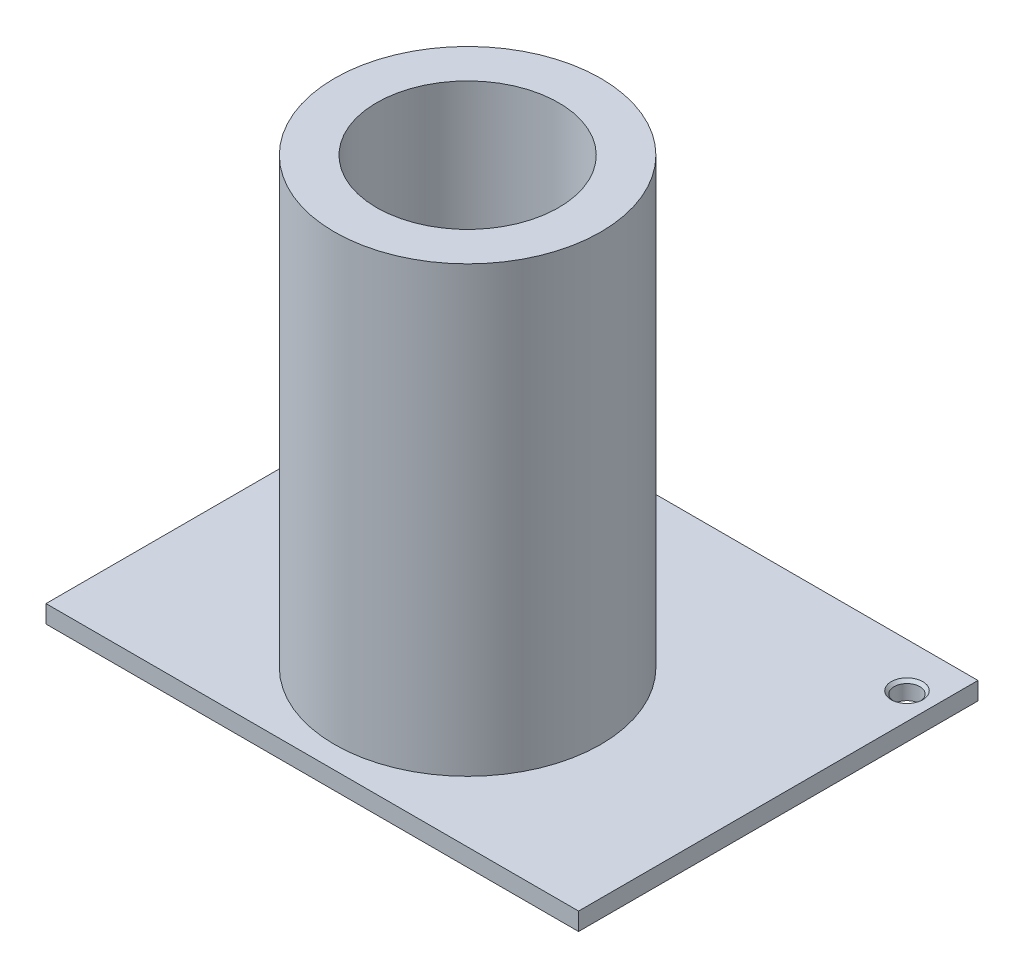
ISO-10303-21;
HEADER;
FILE_DESCRIPTION(('STEP AP214'),'2;1');
FILE_NAME('part.step','',(''),(''),'','','');
FILE_SCHEMA(('AUTOMOTIVE_DESIGN { 1 0 10303 214 1 1 1 1 }'));
ENDSEC;
DATA;
#1=APPLICATION_CONTEXT('core data for automotive mechanical design processes');
#2=APPLICATION_PROTOCOL_DEFINITION('international standard','automotive_design',2000,#1);
#3=PRODUCT_CONTEXT('',#1,'mechanical');
#4=PRODUCT('Part','Part','',(#3));
#5=PRODUCT_RELATED_PRODUCT_CATEGORY('part','',(#4));
#6=PRODUCT_DEFINITION_FORMATION('','',#4);
#7=PRODUCT_DEFINITION_CONTEXT('part definition',#1,'design');
#8=PRODUCT_DEFINITION('design','',#6,#7);
#9=PRODUCT_DEFINITION_SHAPE('','',#8);
#10=(LENGTH_UNIT() NAMED_UNIT(*) SI_UNIT(.MILLI.,.METRE.));
#11=(NAMED_UNIT(*) PLANE_ANGLE_UNIT() SI_UNIT($,.RADIAN.));
#12=(NAMED_UNIT(*) SI_UNIT($,.STERADIAN.) SOLID_ANGLE_UNIT());
#13=UNCERTAINTY_MEASURE_WITH_UNIT(LENGTH_MEASURE(1.E-05),#10,'distance_accuracy_value','');
#14=(GEOMETRIC_REPRESENTATION_CONTEXT(3) GLOBAL_UNCERTAINTY_ASSIGNED_CONTEXT((#13)) GLOBAL_UNIT_ASSIGNED_CONTEXT((#10,
#11,#12)) REPRESENTATION_CONTEXT('',''));
#15=CARTESIAN_POINT('',(0.,0.,0.));
#16=DIRECTION('',(0.,0.,1.));
#17=DIRECTION('',(1.,0.,0.));
#18=AXIS2_PLACEMENT_3D('',#15,#16,#17);
#19=CARTESIAN_POINT('',(0.,2.,-30.));
#20=DIRECTION('',(0.,0.,1.));
#21=DIRECTION('',(1.,0.,0.));
#22=AXIS2_PLACEMENT_3D('',#19,#20,#21);
#23=PLANE('',#22);
#24=DIRECTION('',(-1.,0.,0.));
#25=VECTOR('',#24,1.);
#26=CARTESIAN_POINT('',(0.,0.,-30.));
#27=LINE('',#26,#25);
#28=CARTESIAN_POINT('',(0.,0.,-30.));
#29=VERTEX_POINT('',#28);
#30=CARTESIAN_POINT('',(-60.,0.,-30.));
#31=VERTEX_POINT('',#30);
#32=EDGE_CURVE('E110',#29,#31,#27,.T.);
#33=ORIENTED_EDGE('',*,*,#32,.T.);
#34=DIRECTION('',(0.,-1.,0.));
#35=VECTOR('',#34,1.);
#36=CARTESIAN_POINT('',(-60.,2.,-30.));
#37=LINE('',#36,#35);
#38=CARTESIAN_POINT('',(-60.,2.,-30.));
#39=VERTEX_POINT('',#38);
#40=EDGE_CURVE('E51',#39,#31,#37,.T.);
#41=ORIENTED_EDGE('',*,*,#40,.F.);
#42=DIRECTION('',(-1.,0.,0.));
#43=VECTOR('',#42,1.);
#44=CARTESIAN_POINT('',(0.,2.,-30.));
#45=LINE('',#44,#43);
#46=CARTESIAN_POINT('',(0.,2.,-30.));
#47=VERTEX_POINT('',#46);
#48=EDGE_CURVE('E86',#47,#39,#45,.T.);
#49=ORIENTED_EDGE('',*,*,#48,.F.);
#50=DIRECTION('',(0.,-1.,0.));
#51=VECTOR('',#50,1.);
#52=CARTESIAN_POINT('',(0.,2.,-30.));
#53=LINE('',#52,#51);
#54=EDGE_CURVE('E109',#47,#29,#53,.T.);
#55=ORIENTED_EDGE('',*,*,#54,.T.);
#56=EDGE_LOOP('',(#33,#41,#49,#55));
#57=FACE_BOUND('',#56,.T.);
#58=ADVANCED_FACE('F43',(#57),#23,.F.);
#59=CARTESIAN_POINT('',(-60.,2.,0.));
#60=DIRECTION('',(-1.,0.,0.));
#61=DIRECTION('',(0.,0.,1.));
#62=AXIS2_PLACEMENT_3D('',#59,#60,#61);
#63=PLANE('',#62);
#64=DIRECTION('',(0.,0.,-1.));
#65=VECTOR('',#64,1.);
#66=CARTESIAN_POINT('',(-60.,0.,0.));
#67=LINE('',#66,#65);
#68=CARTESIAN_POINT('',(-60.,0.,15.));
#69=VERTEX_POINT('',#68);
#70=EDGE_CURVE('E97',#69,#31,#67,.T.);
#71=ORIENTED_EDGE('',*,*,#70,.F.);
#72=DIRECTION('',(0.,-1.,0.));
#73=VECTOR('',#72,1.);
#74=CARTESIAN_POINT('',(-60.,2.,15.));
#75=LINE('',#74,#73);
#76=CARTESIAN_POINT('',(-60.,2.,15.));
#77=VERTEX_POINT('',#76);
#78=EDGE_CURVE('E92',#77,#69,#75,.T.);
#79=ORIENTED_EDGE('',*,*,#78,.F.);
#80=DIRECTION('',(0.,0.,-1.));
#81=VECTOR('',#80,1.);
#82=CARTESIAN_POINT('',(-60.,2.,0.));
#83=LINE('',#82,#81);
#84=EDGE_CURVE('E95',#77,#39,#83,.T.);
#85=ORIENTED_EDGE('',*,*,#84,.T.);
#86=ORIENTED_EDGE('',*,*,#40,.T.);
#87=EDGE_LOOP('',(#71,#79,#85,#86));
#88=FACE_BOUND('',#87,.T.);
#89=ADVANCED_FACE('F94',(#88),#63,.T.);
#90=CARTESIAN_POINT('',(0.,2.,15.));
#91=DIRECTION('',(0.,0.,-1.));
#92=DIRECTION('',(-1.,0.,0.));
#93=AXIS2_PLACEMENT_3D('',#90,#91,#92);
#94=PLANE('',#93);
#95=DIRECTION('',(1.,0.,0.));
#96=VECTOR('',#95,1.);
#97=CARTESIAN_POINT('',(0.,0.,15.));
#98=LINE('',#97,#96);
#99=CARTESIAN_POINT('',(0.,0.,15.));
#100=VERTEX_POINT('',#99);
#101=EDGE_CURVE('E75',#69,#100,#98,.T.);
#102=ORIENTED_EDGE('',*,*,#101,.T.);
#103=DIRECTION('',(0.,-1.,0.));
#104=VECTOR('',#103,1.);
#105=CARTESIAN_POINT('',(0.,2.,15.));
#106=LINE('',#105,#104);
#107=CARTESIAN_POINT('',(0.,2.,15.));
#108=VERTEX_POINT('',#107);
#109=EDGE_CURVE('E98',#108,#100,#106,.T.);
#110=ORIENTED_EDGE('',*,*,#109,.F.);
#111=DIRECTION('',(1.,0.,0.));
#112=VECTOR('',#111,1.);
#113=CARTESIAN_POINT('',(0.,2.,15.));
#114=LINE('',#113,#112);
#115=EDGE_CURVE('E100',#77,#108,#114,.T.);
#116=ORIENTED_EDGE('',*,*,#115,.F.);
#117=ORIENTED_EDGE('',*,*,#78,.T.);
#118=EDGE_LOOP('',(#102,#110,#116,#117));
#119=FACE_BOUND('',#118,.T.);
#120=ADVANCED_FACE('F101',(#119),#94,.F.);
#121=CARTESIAN_POINT('',(0.,2.,0.));
#122=DIRECTION('',(-1.,0.,0.));
#123=DIRECTION('',(0.,0.,1.));
#124=AXIS2_PLACEMENT_3D('',#121,#122,#123);
#125=PLANE('',#124);
#126=DIRECTION('',(0.,0.,-1.));
#127=VECTOR('',#126,1.);
#128=CARTESIAN_POINT('',(0.,0.,0.));
#129=LINE('',#128,#127);
#130=EDGE_CURVE('E81',#100,#29,#129,.T.);
#131=ORIENTED_EDGE('',*,*,#130,.T.);
#132=ORIENTED_EDGE('',*,*,#54,.F.);
#133=DIRECTION('',(0.,0.,-1.));
#134=VECTOR('',#133,1.);
#135=CARTESIAN_POINT('',(0.,2.,0.));
#136=LINE('',#135,#134);
#137=EDGE_CURVE('E59',#108,#47,#136,.T.);
#138=ORIENTED_EDGE('',*,*,#137,.F.);
#139=ORIENTED_EDGE('',*,*,#109,.T.);
#140=EDGE_LOOP('',(#131,#132,#138,#139));
#141=FACE_BOUND('',#140,.T.);
#142=ADVANCED_FACE('F154',(#141),#125,.F.);
#143=CARTESIAN_POINT('',(0.,2.,0.));
#144=DIRECTION('',(0.,1.,0.));
#145=DIRECTION('',(0.,0.,1.));
#146=AXIS2_PLACEMENT_3D('',#143,#144,#145);
#147=PLANE('',#146);
#148=CARTESIAN_POINT('',(-30.,2.,-2.5));
#149=DIRECTION('',(0.,1.,0.));
#150=DIRECTION('',(0.,0.,1.));
#151=AXIS2_PLACEMENT_3D('',#148,#149,#150);
#152=CIRCLE('',#151,15.);
#153=CARTESIAN_POINT('',(-30.,2.,12.5));
#154=VERTEX_POINT('',#153);
#155=EDGE_CURVE('E331',#154,#154,#152,.T.);
#156=ORIENTED_EDGE('',*,*,#155,.F.);
#157=EDGE_LOOP('',(#156));
#158=FACE_BOUND('',#157,.T.);
#159=CARTESIAN_POINT('',(-3.,2.,-25.));
#160=DIRECTION('',(0.,1.,0.));
#161=DIRECTION('',(0.,0.,1.));
#162=AXIS2_PLACEMENT_3D('',#159,#160,#161);
#163=CIRCLE('',#162,1.775);
#164=CARTESIAN_POINT('',(-3.,2.,-23.225));
#165=VERTEX_POINT('',#164);
#166=EDGE_CURVE('E131',#165,#165,#163,.T.);
#167=ORIENTED_EDGE('',*,*,#166,.F.);
#168=EDGE_LOOP('',(#167));
#169=FACE_BOUND('',#168,.T.);
#170=CARTESIAN_POINT('',(-57.,2.,-25.));
#171=DIRECTION('',(0.,1.,0.));
#172=DIRECTION('',(0.,0.,1.));
#173=AXIS2_PLACEMENT_3D('',#170,#171,#172);
#174=CIRCLE('',#173,1.775);
#175=CARTESIAN_POINT('',(-57.,2.,-23.225));
#176=VERTEX_POINT('',#175);
#177=EDGE_CURVE('E124',#176,#176,#174,.T.);
#178=ORIENTED_EDGE('',*,*,#177,.F.);
#179=EDGE_LOOP('',(#178));
#180=FACE_BOUND('',#179,.T.);
#181=ORIENTED_EDGE('',*,*,#48,.T.);
#182=ORIENTED_EDGE('',*,*,#84,.F.);
#183=ORIENTED_EDGE('',*,*,#115,.T.);
#184=ORIENTED_EDGE('',*,*,#137,.T.);
#185=EDGE_LOOP('',(#181,#182,#183,#184));
#186=FACE_BOUND('',#185,.T.);
#187=ADVANCED_FACE('F103',(#158,#169,#180,#186),#147,.T.);
#188=CARTESIAN_POINT('',(0.,0.,0.));
#189=DIRECTION('',(0.,1.,0.));
#190=DIRECTION('',(0.,0.,1.));
#191=AXIS2_PLACEMENT_3D('',#188,#189,#190);
#192=PLANE('',#191);
#193=CARTESIAN_POINT('',(-3.,0.,-25.));
#194=DIRECTION('',(0.,1.,0.));
#195=DIRECTION('',(0.,0.,1.));
#196=AXIS2_PLACEMENT_3D('',#193,#194,#195);
#197=CIRCLE('',#196,1.45);
#198=CARTESIAN_POINT('',(-3.,0.,-23.55));
#199=VERTEX_POINT('',#198);
#200=EDGE_CURVE('E122',#199,#199,#197,.T.);
#201=ORIENTED_EDGE('',*,*,#200,.T.);
#202=EDGE_LOOP('',(#201));
#203=FACE_BOUND('',#202,.T.);
#204=CARTESIAN_POINT('',(-57.,0.,-25.));
#205=DIRECTION('',(0.,1.,0.));
#206=DIRECTION('',(0.,0.,1.));
#207=AXIS2_PLACEMENT_3D('',#204,#205,#206);
#208=CIRCLE('',#207,1.45);
#209=CARTESIAN_POINT('',(-57.,0.,-23.55));
#210=VERTEX_POINT('',#209);
#211=EDGE_CURVE('E113',#210,#210,#208,.T.);
#212=ORIENTED_EDGE('',*,*,#211,.T.);
#213=EDGE_LOOP('',(#212));
#214=FACE_BOUND('',#213,.T.);
#215=ORIENTED_EDGE('',*,*,#32,.F.);
#216=ORIENTED_EDGE('',*,*,#130,.F.);
#217=ORIENTED_EDGE('',*,*,#101,.F.);
#218=ORIENTED_EDGE('',*,*,#70,.T.);
#219=EDGE_LOOP('',(#215,#216,#217,#218));
#220=FACE_BOUND('',#219,.T.);
#221=ADVANCED_FACE('F153',(#203,#214,#220),#192,.F.);
#222=CARTESIAN_POINT('',(-57.,2.,-25.));
#223=DIRECTION('',(0.,1.,0.));
#224=DIRECTION('',(0.,0.,1.));
#225=AXIS2_PLACEMENT_3D('',#222,#223,#224);
#226=CYLINDRICAL_SURFACE('',#225,1.45);
#227=CARTESIAN_POINT('',(-57.,1.675,-25.));
#228=DIRECTION('',(0.,1.,0.));
#229=DIRECTION('',(0.,0.,1.));
#230=AXIS2_PLACEMENT_3D('',#227,#228,#229);
#231=CIRCLE('',#230,1.45);
#232=CARTESIAN_POINT('',(-57.,1.675,-23.55));
#233=VERTEX_POINT('',#232);
#234=EDGE_CURVE('E121',#233,#233,#231,.T.);
#235=ORIENTED_EDGE('',*,*,#234,.T.);
#236=EDGE_LOOP('',(#235));
#237=FACE_BOUND('',#236,.T.);
#238=ORIENTED_EDGE('',*,*,#211,.F.);
#239=EDGE_LOOP('',(#238));
#240=FACE_BOUND('',#239,.T.);
#241=ADVANCED_FACE('F142',(#237,#240),#226,.F.);
#242=CARTESIAN_POINT('',(-57.,2.,-25.));
#243=DIRECTION('',(0.,1.,0.));
#244=DIRECTION('',(0.,0.,1.));
#245=AXIS2_PLACEMENT_3D('',#242,#243,#244);
#246=CONICAL_SURFACE('',#245,1.775,0.785398163397446);
#247=ORIENTED_EDGE('',*,*,#234,.F.);
#248=EDGE_LOOP('',(#247));
#249=FACE_BOUND('',#248,.T.);
#250=ORIENTED_EDGE('',*,*,#177,.T.);
#251=EDGE_LOOP('',(#250));
#252=FACE_BOUND('',#251,.T.);
#253=ADVANCED_FACE('F145',(#249,#252),#246,.F.);
#254=CARTESIAN_POINT('',(-3.,2.,-25.));
#255=DIRECTION('',(0.,1.,0.));
#256=DIRECTION('',(0.,0.,1.));
#257=AXIS2_PLACEMENT_3D('',#254,#255,#256);
#258=CYLINDRICAL_SURFACE('',#257,1.45);
#259=CARTESIAN_POINT('',(-3.,1.675,-25.));
#260=DIRECTION('',(0.,1.,0.));
#261=DIRECTION('',(0.,0.,1.));
#262=AXIS2_PLACEMENT_3D('',#259,#260,#261);
#263=CIRCLE('',#262,1.45);
#264=CARTESIAN_POINT('',(-3.,1.675,-23.55));
#265=VERTEX_POINT('',#264);
#266=EDGE_CURVE('E125',#265,#265,#263,.T.);
#267=ORIENTED_EDGE('',*,*,#266,.T.);
#268=EDGE_LOOP('',(#267));
#269=FACE_BOUND('',#268,.T.);
#270=ORIENTED_EDGE('',*,*,#200,.F.);
#271=EDGE_LOOP('',(#270));
#272=FACE_BOUND('',#271,.T.);
#273=ADVANCED_FACE('F148',(#269,#272),#258,.F.);
#274=CARTESIAN_POINT('',(-3.,2.,-25.));
#275=DIRECTION('',(0.,1.,0.));
#276=DIRECTION('',(0.,0.,1.));
#277=AXIS2_PLACEMENT_3D('',#274,#275,#276);
#278=CONICAL_SURFACE('',#277,1.775,0.785398163397449);
#279=ORIENTED_EDGE('',*,*,#266,.F.);
#280=EDGE_LOOP('',(#279));
#281=FACE_BOUND('',#280,.T.);
#282=ORIENTED_EDGE('',*,*,#166,.T.);
#283=EDGE_LOOP('',(#282));
#284=FACE_BOUND('',#283,.T.);
#285=ADVANCED_FACE('F222',(#281,#284),#278,.F.);
#286=CARTESIAN_POINT('',(-30.,52.,-2.5));
#287=DIRECTION('',(0.,1.,0.));
#288=DIRECTION('',(0.,0.,1.));
#289=AXIS2_PLACEMENT_3D('',#286,#287,#288);
#290=PLANE('',#289);
#291=CARTESIAN_POINT('',(-30.,52.,-2.5));
#292=DIRECTION('',(0.,1.,0.));
#293=DIRECTION('',(0.,0.,1.));
#294=AXIS2_PLACEMENT_3D('',#291,#292,#293);
#295=CIRCLE('',#294,15.);
#296=CARTESIAN_POINT('',(-30.,52.,12.5));
#297=VERTEX_POINT('',#296);
#298=EDGE_CURVE('E136',#297,#297,#295,.T.);
#299=ORIENTED_EDGE('',*,*,#298,.T.);
#300=EDGE_LOOP('',(#299));
#301=FACE_BOUND('',#300,.T.);
#302=CARTESIAN_POINT('',(-30.,52.,-2.5));
#303=DIRECTION('',(0.,1.,0.));
#304=DIRECTION('',(0.,0.,1.));
#305=AXIS2_PLACEMENT_3D('',#302,#303,#304);
#306=CIRCLE('',#305,10.25);
#307=CARTESIAN_POINT('',(-30.,52.,7.75));
#308=VERTEX_POINT('',#307);
#309=EDGE_CURVE('E328',#308,#308,#306,.T.);
#310=ORIENTED_EDGE('',*,*,#309,.F.);
#311=EDGE_LOOP('',(#310));
#312=FACE_BOUND('',#311,.T.);
#313=ADVANCED_FACE('F231',(#301,#312),#290,.T.);
#314=CARTESIAN_POINT('',(-30.,52.,-2.5));
#315=DIRECTION('',(0.,-1.,0.));
#316=DIRECTION('',(0.,0.,-1.));
#317=AXIS2_PLACEMENT_3D('',#314,#315,#316);
#318=CYLINDRICAL_SURFACE('',#317,15.);
#319=ORIENTED_EDGE('',*,*,#298,.F.);
#320=EDGE_LOOP('',(#319));
#321=FACE_BOUND('',#320,.T.);
#322=ORIENTED_EDGE('',*,*,#155,.T.);
#323=EDGE_LOOP('',(#322));
#324=FACE_BOUND('',#323,.T.);
#325=ADVANCED_FACE('F248',(#321,#324),#318,.T.);
#326=CARTESIAN_POINT('',(-30.,52.,-2.5));
#327=DIRECTION('',(0.,-1.,0.));
#328=DIRECTION('',(0.,0.,-1.));
#329=AXIS2_PLACEMENT_3D('',#326,#327,#328);
#330=CYLINDRICAL_SURFACE('',#329,10.25);
#331=ORIENTED_EDGE('',*,*,#309,.T.);
#332=EDGE_LOOP('',(#331));
#333=FACE_BOUND('',#332,.T.);
#334=CARTESIAN_POINT('',(-30.,2.,-2.5));
#335=DIRECTION('',(0.,1.,0.));
#336=DIRECTION('',(0.,0.,1.));
#337=AXIS2_PLACEMENT_3D('',#334,#335,#336);
#338=CIRCLE('',#337,10.25);
#339=CARTESIAN_POINT('',(-30.,2.,7.75));
#340=VERTEX_POINT('',#339);
#341=EDGE_CURVE('E11',#340,#340,#338,.F.);
#342=ORIENTED_EDGE('',*,*,#341,.T.);
#343=EDGE_LOOP('',(#342));
#344=FACE_BOUND('',#343,.T.);
#345=ADVANCED_FACE('F168',(#333,#344),#330,.F.);
#346=ORIENTED_EDGE('',*,*,#341,.F.);
#347=EDGE_LOOP('',(#346));
#348=FACE_BOUND('',#347,.T.);
#349=ADVANCED_FACE('F157',(#348),#147,.T.);
#350=CLOSED_SHELL('',(#58,#89,#120,#142,#187,#221,#241,#253,#273,#285,#313,#325,#345,#349));
#351=MANIFOLD_SOLID_BREP('B2',#350);
#352=ADVANCED_BREP_SHAPE_REPRESENTATION('',(#18,#351),#14);
#353=SHAPE_DEFINITION_REPRESENTATION(#9,#352);
ENDSEC;
END-ISO-10303-21;
